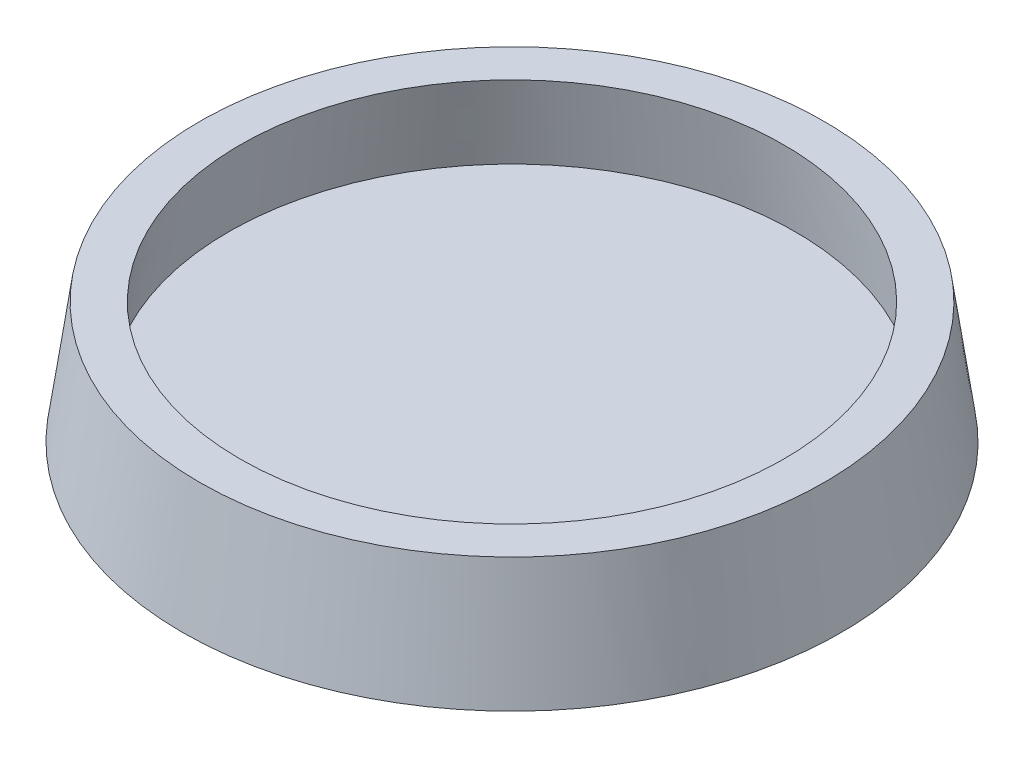
ISO-10303-21;
HEADER;
FILE_DESCRIPTION(('STEP AP214'),'2;1');
FILE_NAME('part.step','',(''),(''),'','','');
FILE_SCHEMA(('AUTOMOTIVE_DESIGN { 1 0 10303 214 1 1 1 1 }'));
ENDSEC;
DATA;
#1=APPLICATION_CONTEXT('core data for automotive mechanical design processes');
#2=APPLICATION_PROTOCOL_DEFINITION('international standard','automotive_design',2000,#1);
#3=PRODUCT_CONTEXT('',#1,'mechanical');
#4=PRODUCT('Part','Part','',(#3));
#5=PRODUCT_RELATED_PRODUCT_CATEGORY('part','',(#4));
#6=PRODUCT_DEFINITION_FORMATION('','',#4);
#7=PRODUCT_DEFINITION_CONTEXT('part definition',#1,'design');
#8=PRODUCT_DEFINITION('design','',#6,#7);
#9=PRODUCT_DEFINITION_SHAPE('','',#8);
#10=(LENGTH_UNIT() NAMED_UNIT(*) SI_UNIT(.MILLI.,.METRE.));
#11=(NAMED_UNIT(*) PLANE_ANGLE_UNIT() SI_UNIT($,.RADIAN.));
#12=(NAMED_UNIT(*) SI_UNIT($,.STERADIAN.) SOLID_ANGLE_UNIT());
#13=UNCERTAINTY_MEASURE_WITH_UNIT(LENGTH_MEASURE(1.E-05),#10,'distance_accuracy_value','');
#14=(GEOMETRIC_REPRESENTATION_CONTEXT(3) GLOBAL_UNCERTAINTY_ASSIGNED_CONTEXT((#13)) GLOBAL_UNIT_ASSIGNED_CONTEXT((#10,
#11,#12)) REPRESENTATION_CONTEXT('',''));
#15=CARTESIAN_POINT('',(0.,0.,0.));
#16=DIRECTION('',(0.,0.,1.));
#17=DIRECTION('',(1.,0.,0.));
#18=AXIS2_PLACEMENT_3D('',#15,#16,#17);
#19=CARTESIAN_POINT('',(0.,0.,0.));
#20=DIRECTION('',(0.,1.,0.));
#21=DIRECTION('',(0.,0.,1.));
#22=AXIS2_PLACEMENT_3D('',#19,#20,#21);
#23=PLANE('',#22);
#24=CARTESIAN_POINT('',(0.,0.,0.));
#25=DIRECTION('',(0.,1.,0.));
#26=DIRECTION('',(0.,0.,1.));
#27=AXIS2_PLACEMENT_3D('',#24,#25,#26);
#28=CIRCLE('',#27,40.702704173512);
#29=CARTESIAN_POINT('',(0.,0.,40.702704173512));
#30=VERTEX_POINT('',#29);
#31=EDGE_CURVE('E10',#30,#30,#28,.T.);
#32=ORIENTED_EDGE('',*,*,#31,.F.);
#33=EDGE_LOOP('',(#32));
#34=FACE_BOUND('',#33,.T.);
#35=ADVANCED_FACE('F31',(#34),#23,.F.);
#36=CARTESIAN_POINT('',(0.,0.,0.));
#37=DIRECTION('',(0.,-1.,0.));
#38=DIRECTION('',(0.,0.,-1.));
#39=AXIS2_PLACEMENT_3D('',#36,#37,#38);
#40=CONICAL_SURFACE('',#39,40.702704173512,0.139626340159551);
#41=CARTESIAN_POINT('',(0.,15.,0.));
#42=DIRECTION('',(0.,1.,0.));
#43=DIRECTION('',(0.,0.,1.));
#44=AXIS2_PLACEMENT_3D('',#41,#42,#43);
#45=CIRCLE('',#44,38.594591652976);
#46=CARTESIAN_POINT('',(0.,15.,38.594591652976));
#47=VERTEX_POINT('',#46);
#48=EDGE_CURVE('E37',#47,#47,#45,.T.);
#49=ORIENTED_EDGE('',*,*,#48,.F.);
#50=EDGE_LOOP('',(#49));
#51=FACE_BOUND('',#50,.T.);
#52=ORIENTED_EDGE('',*,*,#31,.T.);
#53=EDGE_LOOP('',(#52));
#54=FACE_BOUND('',#53,.T.);
#55=ADVANCED_FACE('F61',(#51,#54),#40,.T.);
#56=CARTESIAN_POINT('',(0.,15.,-38.594591652976));
#57=DIRECTION('',(0.,-1.,0.));
#58=DIRECTION('',(0.,0.,-1.));
#59=AXIS2_PLACEMENT_3D('',#56,#57,#58);
#60=PLANE('',#59);
#61=CARTESIAN_POINT('',(0.,15.,0.));
#62=DIRECTION('',(0.,1.,0.));
#63=DIRECTION('',(0.,0.,1.));
#64=AXIS2_PLACEMENT_3D('',#61,#62,#63);
#65=CIRCLE('',#64,33.594591652976);
#66=CARTESIAN_POINT('',(0.,15.,33.594591652976));
#67=VERTEX_POINT('',#66);
#68=EDGE_CURVE('E41',#67,#67,#65,.T.);
#69=ORIENTED_EDGE('',*,*,#68,.F.);
#70=EDGE_LOOP('',(#69));
#71=FACE_BOUND('',#70,.T.);
#72=ORIENTED_EDGE('',*,*,#48,.T.);
#73=EDGE_LOOP('',(#72));
#74=FACE_BOUND('',#73,.T.);
#75=ADVANCED_FACE('F56',(#71,#74),#60,.F.);
#76=CARTESIAN_POINT('',(0.,15.,0.));
#77=DIRECTION('',(0.,-1.,0.));
#78=DIRECTION('',(0.,0.,-1.));
#79=AXIS2_PLACEMENT_3D('',#76,#77,#78);
#80=CONICAL_SURFACE('',#79,33.594591652976,0.13962634015955);
#81=CARTESIAN_POINT('',(0.,5.,0.));
#82=DIRECTION('',(0.,1.,0.));
#83=DIRECTION('',(0.,0.,1.));
#84=AXIS2_PLACEMENT_3D('',#81,#82,#83);
#85=CIRCLE('',#84,35.);
#86=CARTESIAN_POINT('',(0.,5.,35.));
#87=VERTEX_POINT('',#86);
#88=EDGE_CURVE('E45',#87,#87,#85,.T.);
#89=ORIENTED_EDGE('',*,*,#88,.F.);
#90=EDGE_LOOP('',(#89));
#91=FACE_BOUND('',#90,.T.);
#92=ORIENTED_EDGE('',*,*,#68,.T.);
#93=EDGE_LOOP('',(#92));
#94=FACE_BOUND('',#93,.T.);
#95=ADVANCED_FACE('F53',(#91,#94),#80,.F.);
#96=CARTESIAN_POINT('',(0.,5.,-35.));
#97=DIRECTION('',(0.,-1.,0.));
#98=DIRECTION('',(0.,0.,-1.));
#99=AXIS2_PLACEMENT_3D('',#96,#97,#98);
#100=PLANE('',#99);
#101=ORIENTED_EDGE('',*,*,#88,.T.);
#102=EDGE_LOOP('',(#101));
#103=FACE_BOUND('',#102,.T.);
#104=ADVANCED_FACE('F51',(#103),#100,.F.);
#105=CLOSED_SHELL('',(#35,#55,#75,#95,#104));
#106=MANIFOLD_SOLID_BREP('B2',#105);
#107=ADVANCED_BREP_SHAPE_REPRESENTATION('',(#18,#106),#14);
#108=SHAPE_DEFINITION_REPRESENTATION(#9,#107);
ENDSEC;
END-ISO-10303-21;
